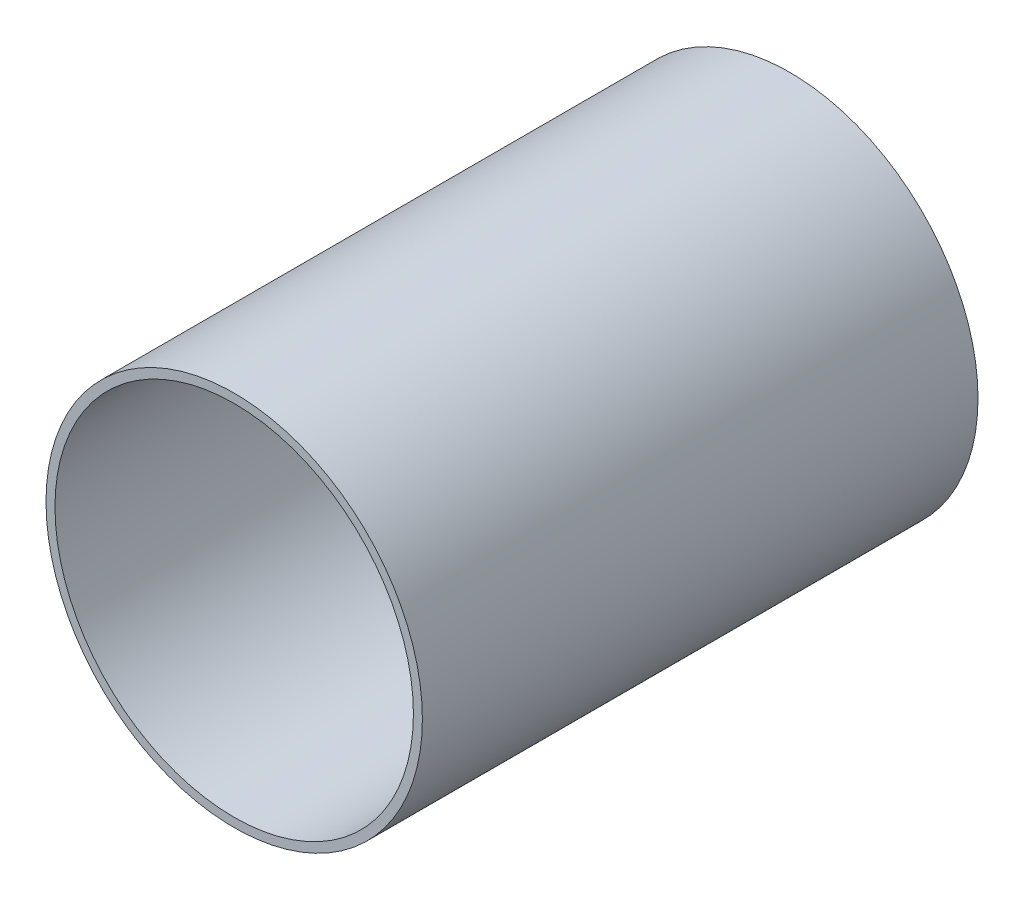
ISO-10303-21;
HEADER;
FILE_DESCRIPTION(('STEP AP214'),'2;1');
FILE_NAME('part.step','',(''),(''),'','','');
FILE_SCHEMA(('AUTOMOTIVE_DESIGN { 1 0 10303 214 1 1 1 1 }'));
ENDSEC;
DATA;
#1=APPLICATION_CONTEXT('core data for automotive mechanical design processes');
#2=APPLICATION_PROTOCOL_DEFINITION('international standard','automotive_design',2000,#1);
#3=PRODUCT_CONTEXT('',#1,'mechanical');
#4=PRODUCT('Part','Part','',(#3));
#5=PRODUCT_RELATED_PRODUCT_CATEGORY('part','',(#4));
#6=PRODUCT_DEFINITION_FORMATION('','',#4);
#7=PRODUCT_DEFINITION_CONTEXT('part definition',#1,'design');
#8=PRODUCT_DEFINITION('design','',#6,#7);
#9=PRODUCT_DEFINITION_SHAPE('','',#8);
#10=(LENGTH_UNIT() NAMED_UNIT(*) SI_UNIT(.MILLI.,.METRE.));
#11=(NAMED_UNIT(*) PLANE_ANGLE_UNIT() SI_UNIT($,.RADIAN.));
#12=(NAMED_UNIT(*) SI_UNIT($,.STERADIAN.) SOLID_ANGLE_UNIT());
#13=UNCERTAINTY_MEASURE_WITH_UNIT(LENGTH_MEASURE(1.E-05),#10,'distance_accuracy_value','');
#14=(GEOMETRIC_REPRESENTATION_CONTEXT(3) GLOBAL_UNCERTAINTY_ASSIGNED_CONTEXT((#13)) GLOBAL_UNIT_ASSIGNED_CONTEXT((#10,
#11,#12)) REPRESENTATION_CONTEXT('',''));
#15=CARTESIAN_POINT('',(0.,0.,0.));
#16=DIRECTION('',(0.,0.,1.));
#17=DIRECTION('',(1.,0.,0.));
#18=AXIS2_PLACEMENT_3D('',#15,#16,#17);
#19=CARTESIAN_POINT('',(0.,0.,15.5));
#20=DIRECTION('',(0.,0.,1.));
#21=DIRECTION('',(1.,0.,0.));
#22=AXIS2_PLACEMENT_3D('',#19,#20,#21);
#23=PLANE('',#22);
#24=CARTESIAN_POINT('',(0.,0.,15.5));
#25=DIRECTION('',(0.,0.,1.));
#26=DIRECTION('',(1.,0.,0.));
#27=AXIS2_PLACEMENT_3D('',#24,#25,#26);
#28=CIRCLE('',#27,5.25);
#29=CARTESIAN_POINT('',(5.25,0.,15.5));
#30=VERTEX_POINT('',#29);
#31=EDGE_CURVE('E10',#30,#30,#28,.T.);
#32=ORIENTED_EDGE('',*,*,#31,.T.);
#33=EDGE_LOOP('',(#32));
#34=FACE_BOUND('',#33,.T.);
#35=CARTESIAN_POINT('',(0.,0.,15.5));
#36=DIRECTION('',(0.,0.,1.));
#37=DIRECTION('',(1.,0.,0.));
#38=AXIS2_PLACEMENT_3D('',#35,#36,#37);
#39=CIRCLE('',#38,5.);
#40=CARTESIAN_POINT('',(5.,0.,15.5));
#41=VERTEX_POINT('',#40);
#42=EDGE_CURVE('E47',#41,#41,#39,.T.);
#43=ORIENTED_EDGE('',*,*,#42,.F.);
#44=EDGE_LOOP('',(#43));
#45=FACE_BOUND('',#44,.T.);
#46=ADVANCED_FACE('F36',(#34,#45),#23,.T.);
#47=CARTESIAN_POINT('',(0.,0.,0.));
#48=DIRECTION('',(0.,0.,1.));
#49=DIRECTION('',(1.,0.,0.));
#50=AXIS2_PLACEMENT_3D('',#47,#48,#49);
#51=PLANE('',#50);
#52=CARTESIAN_POINT('',(0.,0.,0.));
#53=DIRECTION('',(0.,0.,1.));
#54=DIRECTION('',(1.,0.,0.));
#55=AXIS2_PLACEMENT_3D('',#52,#53,#54);
#56=CIRCLE('',#55,5.25);
#57=CARTESIAN_POINT('',(5.25,0.,0.));
#58=VERTEX_POINT('',#57);
#59=EDGE_CURVE('E40',#58,#58,#56,.T.);
#60=ORIENTED_EDGE('',*,*,#59,.F.);
#61=EDGE_LOOP('',(#60));
#62=FACE_BOUND('',#61,.T.);
#63=CARTESIAN_POINT('',(0.,0.,0.));
#64=DIRECTION('',(0.,0.,1.));
#65=DIRECTION('',(1.,0.,0.));
#66=AXIS2_PLACEMENT_3D('',#63,#64,#65);
#67=CIRCLE('',#66,5.);
#68=CARTESIAN_POINT('',(5.,0.,0.));
#69=VERTEX_POINT('',#68);
#70=EDGE_CURVE('E49',#69,#69,#67,.T.);
#71=ORIENTED_EDGE('',*,*,#70,.T.);
#72=EDGE_LOOP('',(#71));
#73=FACE_BOUND('',#72,.T.);
#74=ADVANCED_FACE('F59',(#62,#73),#51,.F.);
#75=CARTESIAN_POINT('',(0.,0.,15.5));
#76=DIRECTION('',(0.,0.,-1.));
#77=DIRECTION('',(-1.,0.,0.));
#78=AXIS2_PLACEMENT_3D('',#75,#76,#77);
#79=CYLINDRICAL_SURFACE('',#78,5.25);
#80=ORIENTED_EDGE('',*,*,#31,.F.);
#81=EDGE_LOOP('',(#80));
#82=FACE_BOUND('',#81,.T.);
#83=ORIENTED_EDGE('',*,*,#59,.T.);
#84=EDGE_LOOP('',(#83));
#85=FACE_BOUND('',#84,.T.);
#86=ADVANCED_FACE('F38',(#82,#85),#79,.T.);
#87=CARTESIAN_POINT('',(0.,0.,15.5));
#88=DIRECTION('',(0.,0.,-1.));
#89=DIRECTION('',(-1.,0.,0.));
#90=AXIS2_PLACEMENT_3D('',#87,#88,#89);
#91=CYLINDRICAL_SURFACE('',#90,5.);
#92=ORIENTED_EDGE('',*,*,#42,.T.);
#93=EDGE_LOOP('',(#92));
#94=FACE_BOUND('',#93,.T.);
#95=ORIENTED_EDGE('',*,*,#70,.F.);
#96=EDGE_LOOP('',(#95));
#97=FACE_BOUND('',#96,.T.);
#98=ADVANCED_FACE('F55',(#94,#97),#91,.F.);
#99=CLOSED_SHELL('',(#46,#74,#86,#98));
#100=MANIFOLD_SOLID_BREP('B2',#99);
#101=ADVANCED_BREP_SHAPE_REPRESENTATION('',(#18,#100),#14);
#102=SHAPE_DEFINITION_REPRESENTATION(#9,#101);
ENDSEC;
END-ISO-10303-21;
